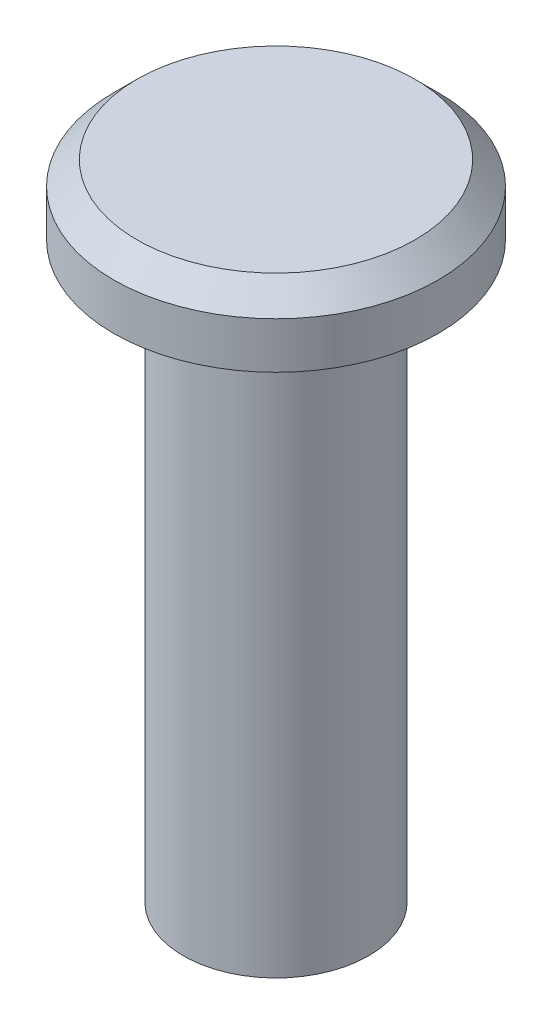
ISO-10303-21;
HEADER;
FILE_DESCRIPTION(('STEP AP214'),'2;1');
FILE_NAME('part.step','',(''),(''),'','','');
FILE_SCHEMA(('AUTOMOTIVE_DESIGN { 1 0 10303 214 1 1 1 1 }'));
ENDSEC;
DATA;
#1=APPLICATION_CONTEXT('core data for automotive mechanical design processes');
#2=APPLICATION_PROTOCOL_DEFINITION('international standard','automotive_design',2000,#1);
#3=PRODUCT_CONTEXT('',#1,'mechanical');
#4=PRODUCT('Part','Part','',(#3));
#5=PRODUCT_RELATED_PRODUCT_CATEGORY('part','',(#4));
#6=PRODUCT_DEFINITION_FORMATION('','',#4);
#7=PRODUCT_DEFINITION_CONTEXT('part definition',#1,'design');
#8=PRODUCT_DEFINITION('design','',#6,#7);
#9=PRODUCT_DEFINITION_SHAPE('','',#8);
#10=(LENGTH_UNIT() NAMED_UNIT(*) SI_UNIT(.MILLI.,.METRE.));
#11=(NAMED_UNIT(*) PLANE_ANGLE_UNIT() SI_UNIT($,.RADIAN.));
#12=(NAMED_UNIT(*) SI_UNIT($,.STERADIAN.) SOLID_ANGLE_UNIT());
#13=UNCERTAINTY_MEASURE_WITH_UNIT(LENGTH_MEASURE(1.E-05),#10,'distance_accuracy_value','');
#14=(GEOMETRIC_REPRESENTATION_CONTEXT(3) GLOBAL_UNCERTAINTY_ASSIGNED_CONTEXT((#13)) GLOBAL_UNIT_ASSIGNED_CONTEXT((#10,
#11,#12)) REPRESENTATION_CONTEXT('',''));
#15=CARTESIAN_POINT('',(0.,0.,0.));
#16=DIRECTION('',(0.,0.,1.));
#17=DIRECTION('',(1.,0.,0.));
#18=AXIS2_PLACEMENT_3D('',#15,#16,#17);
#19=CARTESIAN_POINT('',(0.,0.,0.));
#20=DIRECTION('',(0.,1.,0.));
#21=DIRECTION('',(-1.,0.,0.));
#22=AXIS2_PLACEMENT_3D('',#19,#20,#21);
#23=PLANE('',#22);
#24=CARTESIAN_POINT('',(0.,0.,0.));
#25=DIRECTION('',(0.,1.,0.));
#26=DIRECTION('',(-1.,0.,0.));
#27=AXIS2_PLACEMENT_3D('',#24,#25,#26);
#28=CIRCLE('',#27,4.);
#29=CARTESIAN_POINT('',(-4.,0.,0.));
#30=VERTEX_POINT('',#29);
#31=EDGE_CURVE('E10',#30,#30,#28,.T.);
#32=ORIENTED_EDGE('',*,*,#31,.F.);
#33=EDGE_LOOP('',(#32));
#34=FACE_BOUND('',#33,.T.);
#35=ADVANCED_FACE('F45',(#34),#23,.F.);
#36=CARTESIAN_POINT('',(0.,33.6049720126705,0.));
#37=DIRECTION('',(0.,1.,0.));
#38=DIRECTION('',(-1.,0.,0.));
#39=AXIS2_PLACEMENT_3D('',#36,#37,#38);
#40=CYLINDRICAL_SURFACE('',#39,4.);
#41=CARTESIAN_POINT('',(0.,24.75,0.));
#42=DIRECTION('',(0.,1.,0.));
#43=DIRECTION('',(-1.,0.,0.));
#44=AXIS2_PLACEMENT_3D('',#41,#42,#43);
#45=CIRCLE('',#44,4.);
#46=CARTESIAN_POINT('',(-4.,24.75,0.));
#47=VERTEX_POINT('',#46);
#48=EDGE_CURVE('E51',#47,#47,#45,.T.);
#49=ORIENTED_EDGE('',*,*,#48,.F.);
#50=EDGE_LOOP('',(#49));
#51=FACE_BOUND('',#50,.T.);
#52=ORIENTED_EDGE('',*,*,#31,.T.);
#53=EDGE_LOOP('',(#52));
#54=FACE_BOUND('',#53,.T.);
#55=ADVANCED_FACE('F84',(#51,#54),#40,.T.);
#56=CARTESIAN_POINT('',(4.,24.75,0.));
#57=DIRECTION('',(0.,1.,0.));
#58=DIRECTION('',(-1.,0.,0.));
#59=AXIS2_PLACEMENT_3D('',#56,#57,#58);
#60=PLANE('',#59);
#61=CARTESIAN_POINT('',(0.,24.75,0.));
#62=DIRECTION('',(0.,1.,0.));
#63=DIRECTION('',(-1.,0.,0.));
#64=AXIS2_PLACEMENT_3D('',#61,#62,#63);
#65=CIRCLE('',#64,7.);
#66=CARTESIAN_POINT('',(-7.,24.75,0.));
#67=VERTEX_POINT('',#66);
#68=EDGE_CURVE('E55',#67,#67,#65,.T.);
#69=ORIENTED_EDGE('',*,*,#68,.F.);
#70=EDGE_LOOP('',(#69));
#71=FACE_BOUND('',#70,.T.);
#72=ORIENTED_EDGE('',*,*,#48,.T.);
#73=EDGE_LOOP('',(#72));
#74=FACE_BOUND('',#73,.T.);
#75=ADVANCED_FACE('F79',(#71,#74),#60,.F.);
#76=CARTESIAN_POINT('',(0.,33.6049720126705,0.));
#77=DIRECTION('',(0.,1.,0.));
#78=DIRECTION('',(-1.,0.,0.));
#79=AXIS2_PLACEMENT_3D('',#76,#77,#78);
#80=CYLINDRICAL_SURFACE('',#79,7.);
#81=CARTESIAN_POINT('',(0.,26.75,0.));
#82=DIRECTION('',(0.,1.,0.));
#83=DIRECTION('',(-1.,0.,0.));
#84=AXIS2_PLACEMENT_3D('',#81,#82,#83);
#85=CIRCLE('',#84,7.);
#86=CARTESIAN_POINT('',(-7.,26.75,0.));
#87=VERTEX_POINT('',#86);
#88=EDGE_CURVE('E59',#87,#87,#85,.T.);
#89=ORIENTED_EDGE('',*,*,#88,.F.);
#90=EDGE_LOOP('',(#89));
#91=FACE_BOUND('',#90,.T.);
#92=ORIENTED_EDGE('',*,*,#68,.T.);
#93=EDGE_LOOP('',(#92));
#94=FACE_BOUND('',#93,.T.);
#95=ADVANCED_FACE('F73',(#91,#94),#80,.T.);
#96=CARTESIAN_POINT('',(0.,26.75,0.));
#97=DIRECTION('',(0.,-1.,0.));
#98=DIRECTION('',(1.,0.,0.));
#99=AXIS2_PLACEMENT_3D('',#96,#97,#98);
#100=CONICAL_SURFACE('',#99,7.,0.785398163397448);
#101=CARTESIAN_POINT('',(0.,27.75,0.));
#102=DIRECTION('',(0.,1.,0.));
#103=DIRECTION('',(-1.,0.,0.));
#104=AXIS2_PLACEMENT_3D('',#101,#102,#103);
#105=CIRCLE('',#104,6.);
#106=CARTESIAN_POINT('',(-6.,27.75,0.));
#107=VERTEX_POINT('',#106);
#108=EDGE_CURVE('E64',#107,#107,#105,.T.);
#109=ORIENTED_EDGE('',*,*,#108,.F.);
#110=EDGE_LOOP('',(#109));
#111=FACE_BOUND('',#110,.T.);
#112=ORIENTED_EDGE('',*,*,#88,.T.);
#113=EDGE_LOOP('',(#112));
#114=FACE_BOUND('',#113,.T.);
#115=ADVANCED_FACE('F70',(#111,#114),#100,.T.);
#116=CARTESIAN_POINT('',(6.,27.75,0.));
#117=DIRECTION('',(0.,-1.,0.));
#118=DIRECTION('',(1.,0.,0.));
#119=AXIS2_PLACEMENT_3D('',#116,#117,#118);
#120=PLANE('',#119);
#121=ORIENTED_EDGE('',*,*,#108,.T.);
#122=EDGE_LOOP('',(#121));
#123=FACE_BOUND('',#122,.T.);
#124=ADVANCED_FACE('F68',(#123),#120,.F.);
#125=CLOSED_SHELL('',(#35,#55,#75,#95,#115,#124));
#126=MANIFOLD_SOLID_BREP('B2',#125);
#127=ADVANCED_BREP_SHAPE_REPRESENTATION('',(#18,#126),#14);
#128=SHAPE_DEFINITION_REPRESENTATION(#9,#127);
ENDSEC;
END-ISO-10303-21;
